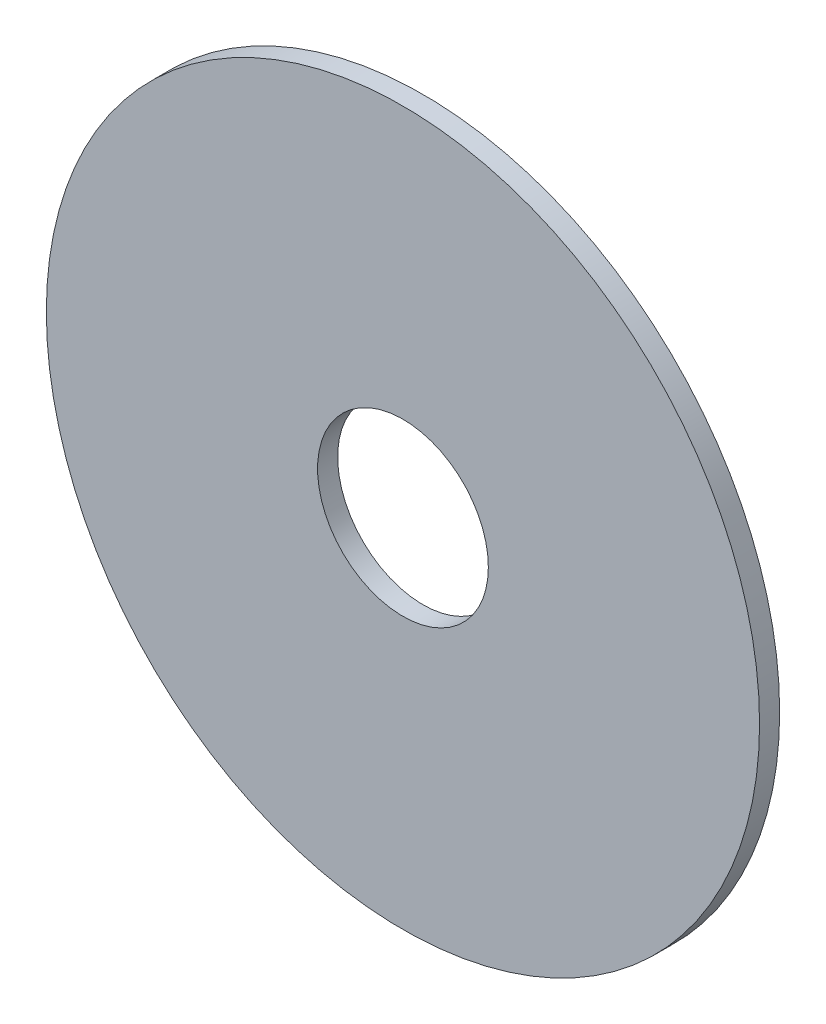
ISO-10303-21;
HEADER;
FILE_DESCRIPTION(('STEP AP214'),'2;1');
FILE_NAME('part.step','',(''),(''),'','','');
FILE_SCHEMA(('AUTOMOTIVE_DESIGN { 1 0 10303 214 1 1 1 1 }'));
ENDSEC;
DATA;
#1=APPLICATION_CONTEXT('core data for automotive mechanical design processes');
#2=APPLICATION_PROTOCOL_DEFINITION('international standard','automotive_design',2000,#1);
#3=PRODUCT_CONTEXT('',#1,'mechanical');
#4=PRODUCT('Part','Part','',(#3));
#5=PRODUCT_RELATED_PRODUCT_CATEGORY('part','',(#4));
#6=PRODUCT_DEFINITION_FORMATION('','',#4);
#7=PRODUCT_DEFINITION_CONTEXT('part definition',#1,'design');
#8=PRODUCT_DEFINITION('design','',#6,#7);
#9=PRODUCT_DEFINITION_SHAPE('','',#8);
#10=(LENGTH_UNIT() NAMED_UNIT(*) SI_UNIT(.MILLI.,.METRE.));
#11=(NAMED_UNIT(*) PLANE_ANGLE_UNIT() SI_UNIT($,.RADIAN.));
#12=(NAMED_UNIT(*) SI_UNIT($,.STERADIAN.) SOLID_ANGLE_UNIT());
#13=UNCERTAINTY_MEASURE_WITH_UNIT(LENGTH_MEASURE(1.E-05),#10,'distance_accuracy_value','');
#14=(GEOMETRIC_REPRESENTATION_CONTEXT(3) GLOBAL_UNCERTAINTY_ASSIGNED_CONTEXT((#13)) GLOBAL_UNIT_ASSIGNED_CONTEXT((#10,
#11,#12)) REPRESENTATION_CONTEXT('',''));
#15=CARTESIAN_POINT('',(0.,0.,0.));
#16=DIRECTION('',(0.,0.,1.));
#17=DIRECTION('',(1.,0.,0.));
#18=AXIS2_PLACEMENT_3D('',#15,#16,#17);
#19=CARTESIAN_POINT('',(0.,0.,10.));
#20=DIRECTION('',(0.,0.,1.));
#21=DIRECTION('',(1.,0.,0.));
#22=AXIS2_PLACEMENT_3D('',#19,#20,#21);
#23=PLANE('',#22);
#24=CARTESIAN_POINT('',(0.,0.,10.));
#25=DIRECTION('',(0.,0.,1.));
#26=DIRECTION('',(1.,0.,0.));
#27=AXIS2_PLACEMENT_3D('',#24,#25,#26);
#28=CIRCLE('',#27,177.5);
#29=CARTESIAN_POINT('',(177.5,0.,10.));
#30=VERTEX_POINT('',#29);
#31=EDGE_CURVE('E10',#30,#30,#28,.T.);
#32=ORIENTED_EDGE('',*,*,#31,.T.);
#33=EDGE_LOOP('',(#32));
#34=FACE_BOUND('',#33,.T.);
#35=CARTESIAN_POINT('',(0.,0.,10.));
#36=DIRECTION('',(0.,0.,1.));
#37=DIRECTION('',(1.,0.,0.));
#38=AXIS2_PLACEMENT_3D('',#35,#36,#37);
#39=CIRCLE('',#38,42.5);
#40=CARTESIAN_POINT('',(42.5,0.,10.));
#41=VERTEX_POINT('',#40);
#42=EDGE_CURVE('E45',#41,#41,#39,.T.);
#43=ORIENTED_EDGE('',*,*,#42,.F.);
#44=EDGE_LOOP('',(#43));
#45=FACE_BOUND('',#44,.T.);
#46=ADVANCED_FACE('F34',(#34,#45),#23,.T.);
#47=CARTESIAN_POINT('',(0.,0.,0.));
#48=DIRECTION('',(0.,0.,1.));
#49=DIRECTION('',(1.,0.,0.));
#50=AXIS2_PLACEMENT_3D('',#47,#48,#49);
#51=PLANE('',#50);
#52=CARTESIAN_POINT('',(0.,0.,0.));
#53=DIRECTION('',(0.,0.,1.));
#54=DIRECTION('',(1.,0.,0.));
#55=AXIS2_PLACEMENT_3D('',#52,#53,#54);
#56=CIRCLE('',#55,177.5);
#57=CARTESIAN_POINT('',(177.5,0.,0.));
#58=VERTEX_POINT('',#57);
#59=EDGE_CURVE('E38',#58,#58,#56,.T.);
#60=ORIENTED_EDGE('',*,*,#59,.F.);
#61=EDGE_LOOP('',(#60));
#62=FACE_BOUND('',#61,.T.);
#63=CARTESIAN_POINT('',(0.,0.,0.));
#64=DIRECTION('',(0.,0.,1.));
#65=DIRECTION('',(1.,0.,0.));
#66=AXIS2_PLACEMENT_3D('',#63,#64,#65);
#67=CIRCLE('',#66,42.5);
#68=CARTESIAN_POINT('',(42.5,0.,0.));
#69=VERTEX_POINT('',#68);
#70=EDGE_CURVE('E47',#69,#69,#67,.T.);
#71=ORIENTED_EDGE('',*,*,#70,.T.);
#72=EDGE_LOOP('',(#71));
#73=FACE_BOUND('',#72,.T.);
#74=ADVANCED_FACE('F57',(#62,#73),#51,.F.);
#75=CARTESIAN_POINT('',(0.,0.,10.));
#76=DIRECTION('',(0.,0.,-1.));
#77=DIRECTION('',(-1.,0.,0.));
#78=AXIS2_PLACEMENT_3D('',#75,#76,#77);
#79=CYLINDRICAL_SURFACE('',#78,177.5);
#80=ORIENTED_EDGE('',*,*,#31,.F.);
#81=EDGE_LOOP('',(#80));
#82=FACE_BOUND('',#81,.T.);
#83=ORIENTED_EDGE('',*,*,#59,.T.);
#84=EDGE_LOOP('',(#83));
#85=FACE_BOUND('',#84,.T.);
#86=ADVANCED_FACE('F36',(#82,#85),#79,.T.);
#87=CARTESIAN_POINT('',(0.,0.,10.));
#88=DIRECTION('',(0.,0.,-1.));
#89=DIRECTION('',(-1.,0.,0.));
#90=AXIS2_PLACEMENT_3D('',#87,#88,#89);
#91=CYLINDRICAL_SURFACE('',#90,42.5);
#92=ORIENTED_EDGE('',*,*,#42,.T.);
#93=EDGE_LOOP('',(#92));
#94=FACE_BOUND('',#93,.T.);
#95=ORIENTED_EDGE('',*,*,#70,.F.);
#96=EDGE_LOOP('',(#95));
#97=FACE_BOUND('',#96,.T.);
#98=ADVANCED_FACE('F53',(#94,#97),#91,.F.);
#99=CLOSED_SHELL('',(#46,#74,#86,#98));
#100=MANIFOLD_SOLID_BREP('B2',#99);
#101=ADVANCED_BREP_SHAPE_REPRESENTATION('',(#18,#100),#14);
#102=SHAPE_DEFINITION_REPRESENTATION(#9,#101);
ENDSEC;
END-ISO-10303-21;
